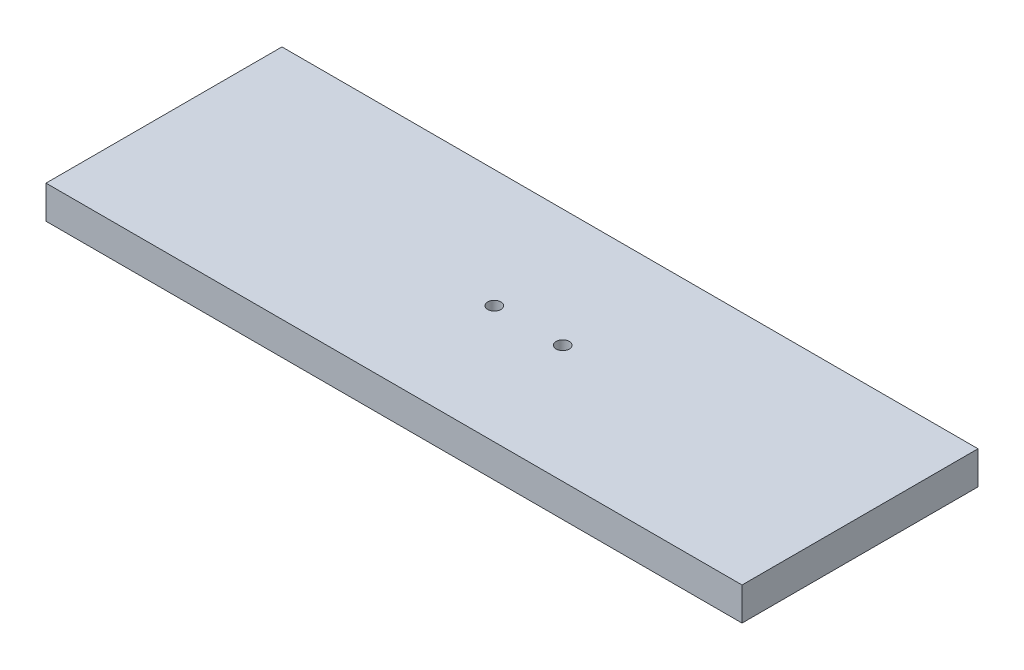
ISO-10303-21;
HEADER;
FILE_DESCRIPTION(('STEP AP214'),'2;1');
FILE_NAME('part.step','',(''),(''),'','','');
FILE_SCHEMA(('AUTOMOTIVE_DESIGN { 1 0 10303 214 1 1 1 1 }'));
ENDSEC;
DATA;
#1=APPLICATION_CONTEXT('core data for automotive mechanical design processes');
#2=APPLICATION_PROTOCOL_DEFINITION('international standard','automotive_design',2000,#1);
#3=PRODUCT_CONTEXT('',#1,'mechanical');
#4=PRODUCT('Part','Part','',(#3));
#5=PRODUCT_RELATED_PRODUCT_CATEGORY('part','',(#4));
#6=PRODUCT_DEFINITION_FORMATION('','',#4);
#7=PRODUCT_DEFINITION_CONTEXT('part definition',#1,'design');
#8=PRODUCT_DEFINITION('design','',#6,#7);
#9=PRODUCT_DEFINITION_SHAPE('','',#8);
#10=(LENGTH_UNIT() NAMED_UNIT(*) SI_UNIT(.MILLI.,.METRE.));
#11=(NAMED_UNIT(*) PLANE_ANGLE_UNIT() SI_UNIT($,.RADIAN.));
#12=(NAMED_UNIT(*) SI_UNIT($,.STERADIAN.) SOLID_ANGLE_UNIT());
#13=UNCERTAINTY_MEASURE_WITH_UNIT(LENGTH_MEASURE(1.E-05),#10,'distance_accuracy_value','');
#14=(GEOMETRIC_REPRESENTATION_CONTEXT(3) GLOBAL_UNCERTAINTY_ASSIGNED_CONTEXT((#13)) GLOBAL_UNIT_ASSIGNED_CONTEXT((#10,
#11,#12)) REPRESENTATION_CONTEXT('',''));
#15=CARTESIAN_POINT('',(0.,0.,0.));
#16=DIRECTION('',(0.,0.,1.));
#17=DIRECTION('',(1.,0.,0.));
#18=AXIS2_PLACEMENT_3D('',#15,#16,#17);
#19=CARTESIAN_POINT('',(187.325,8.89,127.));
#20=DIRECTION('',(-1.,0.,0.));
#21=DIRECTION('',(0.,0.,1.));
#22=AXIS2_PLACEMENT_3D('',#19,#20,#21);
#23=PLANE('',#22);
#24=DIRECTION('',(0.,1.,0.));
#25=VECTOR('',#24,1.);
#26=CARTESIAN_POINT('',(187.325,8.89,0.));
#27=LINE('',#26,#25);
#28=CARTESIAN_POINT('',(187.325,-8.89,0.));
#29=VERTEX_POINT('',#28);
#30=CARTESIAN_POINT('',(187.325,8.89,0.));
#31=VERTEX_POINT('',#30);
#32=EDGE_CURVE('E110',#29,#31,#27,.T.);
#33=ORIENTED_EDGE('',*,*,#32,.T.);
#34=DIRECTION('',(0.,0.,-1.));
#35=VECTOR('',#34,1.);
#36=CARTESIAN_POINT('',(187.325,8.89,127.));
#37=LINE('',#36,#35);
#38=CARTESIAN_POINT('',(187.325,8.89,127.));
#39=VERTEX_POINT('',#38);
#40=EDGE_CURVE('E11',#39,#31,#37,.T.);
#41=ORIENTED_EDGE('',*,*,#40,.F.);
#42=DIRECTION('',(0.,1.,0.));
#43=VECTOR('',#42,1.);
#44=CARTESIAN_POINT('',(187.325,8.89,127.));
#45=LINE('',#44,#43);
#46=CARTESIAN_POINT('',(187.325,-8.89,127.));
#47=VERTEX_POINT('',#46);
#48=EDGE_CURVE('E98',#47,#39,#45,.T.);
#49=ORIENTED_EDGE('',*,*,#48,.F.);
#50=DIRECTION('',(0.,0.,-1.));
#51=VECTOR('',#50,1.);
#52=CARTESIAN_POINT('',(187.325,-8.89,127.));
#53=LINE('',#52,#51);
#54=EDGE_CURVE('E106',#47,#29,#53,.T.);
#55=ORIENTED_EDGE('',*,*,#54,.T.);
#56=EDGE_LOOP('',(#33,#41,#49,#55));
#57=FACE_BOUND('',#56,.T.);
#58=ADVANCED_FACE('F47',(#57),#23,.F.);
#59=CARTESIAN_POINT('',(-187.325,8.89,127.));
#60=DIRECTION('',(0.,-1.,0.));
#61=DIRECTION('',(0.,0.,-1.));
#62=AXIS2_PLACEMENT_3D('',#59,#60,#61);
#63=PLANE('',#62);
#64=CARTESIAN_POINT('',(-9.52500000000001,8.89,63.5));
#65=DIRECTION('',(0.,-1.,0.));
#66=DIRECTION('',(0.,0.,-1.));
#67=AXIS2_PLACEMENT_3D('',#64,#65,#66);
#68=CIRCLE('',#67,3.556);
#69=CARTESIAN_POINT('',(-9.52500000000001,8.89,59.944));
#70=VERTEX_POINT('',#69);
#71=EDGE_CURVE('E113',#70,#70,#68,.T.);
#72=ORIENTED_EDGE('',*,*,#71,.T.);
#73=EDGE_LOOP('',(#72));
#74=FACE_BOUND('',#73,.T.);
#75=CARTESIAN_POINT('',(27.305,8.89,63.5));
#76=DIRECTION('',(0.,-1.,0.));
#77=DIRECTION('',(0.,0.,-1.));
#78=AXIS2_PLACEMENT_3D('',#75,#76,#77);
#79=CIRCLE('',#78,3.556);
#80=CARTESIAN_POINT('',(27.305,8.89,59.944));
#81=VERTEX_POINT('',#80);
#82=EDGE_CURVE('E124',#81,#81,#79,.T.);
#83=ORIENTED_EDGE('',*,*,#82,.T.);
#84=EDGE_LOOP('',(#83));
#85=FACE_BOUND('',#84,.T.);
#86=DIRECTION('',(-1.,0.,0.));
#87=VECTOR('',#86,1.);
#88=CARTESIAN_POINT('',(-187.325,8.89,0.));
#89=LINE('',#88,#87);
#90=CARTESIAN_POINT('',(-187.325,8.89,0.));
#91=VERTEX_POINT('',#90);
#92=EDGE_CURVE('E102',#31,#91,#89,.T.);
#93=ORIENTED_EDGE('',*,*,#92,.T.);
#94=DIRECTION('',(0.,0.,-1.));
#95=VECTOR('',#94,1.);
#96=CARTESIAN_POINT('',(-187.325,8.89,127.));
#97=LINE('',#96,#95);
#98=CARTESIAN_POINT('',(-187.325,8.89,127.));
#99=VERTEX_POINT('',#98);
#100=EDGE_CURVE('E55',#99,#91,#97,.T.);
#101=ORIENTED_EDGE('',*,*,#100,.F.);
#102=DIRECTION('',(-1.,0.,0.));
#103=VECTOR('',#102,1.);
#104=CARTESIAN_POINT('',(-187.325,8.89,127.));
#105=LINE('',#104,#103);
#106=EDGE_CURVE('E93',#39,#99,#105,.T.);
#107=ORIENTED_EDGE('',*,*,#106,.F.);
#108=ORIENTED_EDGE('',*,*,#40,.T.);
#109=EDGE_LOOP('',(#93,#101,#107,#108));
#110=FACE_BOUND('',#109,.T.);
#111=ADVANCED_FACE('F101',(#74,#85,#110),#63,.F.);
#112=CARTESIAN_POINT('',(-187.325,8.89,127.));
#113=DIRECTION('',(1.,0.,0.));
#114=DIRECTION('',(0.,0.,-1.));
#115=AXIS2_PLACEMENT_3D('',#112,#113,#114);
#116=PLANE('',#115);
#117=DIRECTION('',(0.,-1.,0.));
#118=VECTOR('',#117,1.);
#119=CARTESIAN_POINT('',(-187.325,8.89,0.));
#120=LINE('',#119,#118);
#121=CARTESIAN_POINT('',(-187.325,-8.89,0.));
#122=VERTEX_POINT('',#121);
#123=EDGE_CURVE('E80',#91,#122,#120,.T.);
#124=ORIENTED_EDGE('',*,*,#123,.T.);
#125=DIRECTION('',(0.,0.,-1.));
#126=VECTOR('',#125,1.);
#127=CARTESIAN_POINT('',(-187.325,-8.89,127.));
#128=LINE('',#127,#126);
#129=CARTESIAN_POINT('',(-187.325,-8.89,127.));
#130=VERTEX_POINT('',#129);
#131=EDGE_CURVE('E103',#130,#122,#128,.T.);
#132=ORIENTED_EDGE('',*,*,#131,.F.);
#133=DIRECTION('',(0.,-1.,0.));
#134=VECTOR('',#133,1.);
#135=CARTESIAN_POINT('',(-187.325,8.89,127.));
#136=LINE('',#135,#134);
#137=EDGE_CURVE('E96',#99,#130,#136,.T.);
#138=ORIENTED_EDGE('',*,*,#137,.F.);
#139=ORIENTED_EDGE('',*,*,#100,.T.);
#140=EDGE_LOOP('',(#124,#132,#138,#139));
#141=FACE_BOUND('',#140,.T.);
#142=ADVANCED_FACE('F104',(#141),#116,.F.);
#143=CARTESIAN_POINT('',(-187.325,-8.89,127.));
#144=DIRECTION('',(0.,1.,0.));
#145=DIRECTION('',(0.,0.,1.));
#146=AXIS2_PLACEMENT_3D('',#143,#144,#145);
#147=PLANE('',#146);
#148=CARTESIAN_POINT('',(-9.52500000000001,-8.89,63.5));
#149=DIRECTION('',(0.,-1.,0.));
#150=DIRECTION('',(0.,0.,-1.));
#151=AXIS2_PLACEMENT_3D('',#148,#149,#150);
#152=CIRCLE('',#151,3.556);
#153=CARTESIAN_POINT('',(-9.52500000000001,-8.89,59.944));
#154=VERTEX_POINT('',#153);
#155=EDGE_CURVE('E130',#154,#154,#152,.T.);
#156=ORIENTED_EDGE('',*,*,#155,.F.);
#157=EDGE_LOOP('',(#156));
#158=FACE_BOUND('',#157,.T.);
#159=CARTESIAN_POINT('',(27.305,-8.89,63.5));
#160=DIRECTION('',(0.,-1.,0.));
#161=DIRECTION('',(0.,0.,-1.));
#162=AXIS2_PLACEMENT_3D('',#159,#160,#161);
#163=CIRCLE('',#162,3.556);
#164=CARTESIAN_POINT('',(27.305,-8.89,59.944));
#165=VERTEX_POINT('',#164);
#166=EDGE_CURVE('E127',#165,#165,#163,.T.);
#167=ORIENTED_EDGE('',*,*,#166,.F.);
#168=EDGE_LOOP('',(#167));
#169=FACE_BOUND('',#168,.T.);
#170=DIRECTION('',(1.,0.,0.));
#171=VECTOR('',#170,1.);
#172=CARTESIAN_POINT('',(-187.325,-8.89,0.));
#173=LINE('',#172,#171);
#174=EDGE_CURVE('E86',#122,#29,#173,.T.);
#175=ORIENTED_EDGE('',*,*,#174,.T.);
#176=ORIENTED_EDGE('',*,*,#54,.F.);
#177=DIRECTION('',(1.,0.,0.));
#178=VECTOR('',#177,1.);
#179=CARTESIAN_POINT('',(-187.325,-8.89,127.));
#180=LINE('',#179,#178);
#181=EDGE_CURVE('E63',#130,#47,#180,.T.);
#182=ORIENTED_EDGE('',*,*,#181,.F.);
#183=ORIENTED_EDGE('',*,*,#131,.T.);
#184=EDGE_LOOP('',(#175,#176,#182,#183));
#185=FACE_BOUND('',#184,.T.);
#186=ADVANCED_FACE('F118',(#158,#169,#185),#147,.F.);
#187=CARTESIAN_POINT('',(0.,0.,127.));
#188=DIRECTION('',(0.,0.,1.));
#189=DIRECTION('',(1.,0.,0.));
#190=AXIS2_PLACEMENT_3D('',#187,#188,#189);
#191=PLANE('',#190);
#192=ORIENTED_EDGE('',*,*,#48,.T.);
#193=ORIENTED_EDGE('',*,*,#106,.T.);
#194=ORIENTED_EDGE('',*,*,#137,.T.);
#195=ORIENTED_EDGE('',*,*,#181,.T.);
#196=EDGE_LOOP('',(#192,#193,#194,#195));
#197=FACE_BOUND('',#196,.T.);
#198=ADVANCED_FACE('F94',(#197),#191,.T.);
#199=CARTESIAN_POINT('',(0.,0.,0.));
#200=DIRECTION('',(0.,0.,1.));
#201=DIRECTION('',(1.,0.,0.));
#202=AXIS2_PLACEMENT_3D('',#199,#200,#201);
#203=PLANE('',#202);
#204=ORIENTED_EDGE('',*,*,#32,.F.);
#205=ORIENTED_EDGE('',*,*,#174,.F.);
#206=ORIENTED_EDGE('',*,*,#123,.F.);
#207=ORIENTED_EDGE('',*,*,#92,.F.);
#208=EDGE_LOOP('',(#204,#205,#206,#207));
#209=FACE_BOUND('',#208,.T.);
#210=ADVANCED_FACE('F121',(#209),#203,.F.);
#211=CARTESIAN_POINT('',(27.305,8.89,63.5));
#212=DIRECTION('',(0.,-1.,0.));
#213=DIRECTION('',(0.,0.,-1.));
#214=AXIS2_PLACEMENT_3D('',#211,#212,#213);
#215=CYLINDRICAL_SURFACE('',#214,3.556);
#216=ORIENTED_EDGE('',*,*,#82,.F.);
#217=EDGE_LOOP('',(#216));
#218=FACE_BOUND('',#217,.T.);
#219=ORIENTED_EDGE('',*,*,#166,.T.);
#220=EDGE_LOOP('',(#219));
#221=FACE_BOUND('',#220,.T.);
#222=ADVANCED_FACE('F141',(#218,#221),#215,.F.);
#223=CARTESIAN_POINT('',(-9.52500000000001,8.89,63.5));
#224=DIRECTION('',(0.,-1.,0.));
#225=DIRECTION('',(0.,0.,-1.));
#226=AXIS2_PLACEMENT_3D('',#223,#224,#225);
#227=CYLINDRICAL_SURFACE('',#226,3.556);
#228=ORIENTED_EDGE('',*,*,#71,.F.);
#229=EDGE_LOOP('',(#228));
#230=FACE_BOUND('',#229,.T.);
#231=ORIENTED_EDGE('',*,*,#155,.T.);
#232=EDGE_LOOP('',(#231));
#233=FACE_BOUND('',#232,.T.);
#234=ADVANCED_FACE('F138',(#230,#233),#227,.F.);
#235=CLOSED_SHELL('',(#58,#111,#142,#186,#198,#210,#222,#234));
#236=MANIFOLD_SOLID_BREP('B2',#235);
#237=ADVANCED_BREP_SHAPE_REPRESENTATION('',(#18,#236),#14);
#238=SHAPE_DEFINITION_REPRESENTATION(#9,#237);
ENDSEC;
END-ISO-10303-21;
